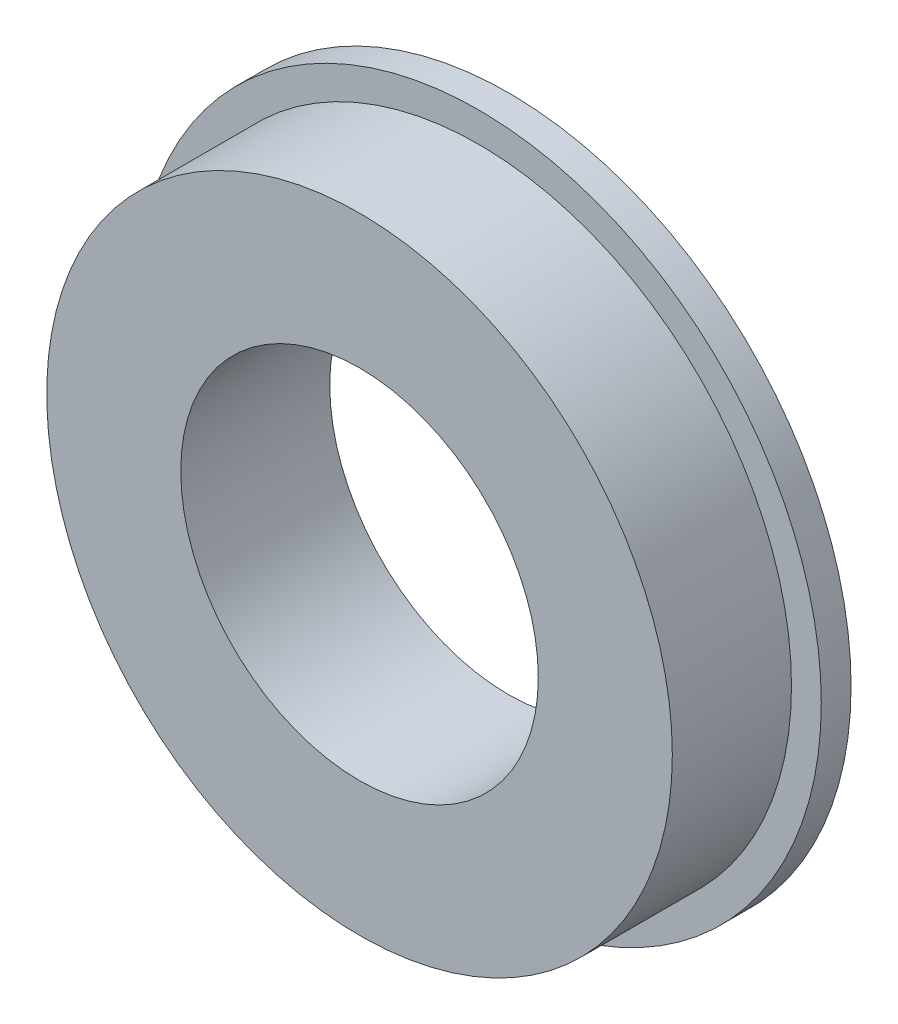
ISO-10303-21;
HEADER;
FILE_DESCRIPTION(('STEP AP214'),'2;1');
FILE_NAME('part.step','',(''),(''),'','','');
FILE_SCHEMA(('AUTOMOTIVE_DESIGN { 1 0 10303 214 1 1 1 1 }'));
ENDSEC;
DATA;
#1=APPLICATION_CONTEXT('core data for automotive mechanical design processes');
#2=APPLICATION_PROTOCOL_DEFINITION('international standard','automotive_design',2000,#1);
#3=PRODUCT_CONTEXT('',#1,'mechanical');
#4=PRODUCT('Part','Part','',(#3));
#5=PRODUCT_RELATED_PRODUCT_CATEGORY('part','',(#4));
#6=PRODUCT_DEFINITION_FORMATION('','',#4);
#7=PRODUCT_DEFINITION_CONTEXT('part definition',#1,'design');
#8=PRODUCT_DEFINITION('design','',#6,#7);
#9=PRODUCT_DEFINITION_SHAPE('','',#8);
#10=(LENGTH_UNIT() NAMED_UNIT(*) SI_UNIT(.MILLI.,.METRE.));
#11=(NAMED_UNIT(*) PLANE_ANGLE_UNIT() SI_UNIT($,.RADIAN.));
#12=(NAMED_UNIT(*) SI_UNIT($,.STERADIAN.) SOLID_ANGLE_UNIT());
#13=UNCERTAINTY_MEASURE_WITH_UNIT(LENGTH_MEASURE(1.E-05),#10,'distance_accuracy_value','');
#14=(GEOMETRIC_REPRESENTATION_CONTEXT(3) GLOBAL_UNCERTAINTY_ASSIGNED_CONTEXT((#13)) GLOBAL_UNIT_ASSIGNED_CONTEXT((#10,
#11,#12)) REPRESENTATION_CONTEXT('',''));
#15=CARTESIAN_POINT('',(0.,0.,0.));
#16=DIRECTION('',(0.,0.,1.));
#17=DIRECTION('',(1.,0.,0.));
#18=AXIS2_PLACEMENT_3D('',#15,#16,#17);
#19=CARTESIAN_POINT('',(0.,0.,1.));
#20=DIRECTION('',(0.,0.,-1.));
#21=DIRECTION('',(-1.,0.,0.));
#22=AXIS2_PLACEMENT_3D('',#19,#20,#21);
#23=CYLINDRICAL_SURFACE('',#22,11.5);
#24=CARTESIAN_POINT('',(0.,0.,1.));
#25=DIRECTION('',(0.,0.,1.));
#26=DIRECTION('',(1.,0.,0.));
#27=AXIS2_PLACEMENT_3D('',#24,#25,#26);
#28=CIRCLE('',#27,11.5);
#29=CARTESIAN_POINT('',(11.5,0.,1.));
#30=VERTEX_POINT('',#29);
#31=EDGE_CURVE('E10',#30,#30,#28,.T.);
#32=ORIENTED_EDGE('',*,*,#31,.F.);
#33=EDGE_LOOP('',(#32));
#34=FACE_BOUND('',#33,.T.);
#35=CARTESIAN_POINT('',(0.,0.,0.));
#36=DIRECTION('',(0.,0.,1.));
#37=DIRECTION('',(1.,0.,0.));
#38=AXIS2_PLACEMENT_3D('',#35,#36,#37);
#39=CIRCLE('',#38,11.5);
#40=CARTESIAN_POINT('',(11.5,0.,0.));
#41=VERTEX_POINT('',#40);
#42=EDGE_CURVE('E36',#41,#41,#39,.T.);
#43=ORIENTED_EDGE('',*,*,#42,.T.);
#44=EDGE_LOOP('',(#43));
#45=FACE_BOUND('',#44,.T.);
#46=ADVANCED_FACE('F33',(#34,#45),#23,.T.);
#47=CARTESIAN_POINT('',(0.,0.,1.));
#48=DIRECTION('',(0.,0.,1.));
#49=DIRECTION('',(1.,0.,0.));
#50=AXIS2_PLACEMENT_3D('',#47,#48,#49);
#51=PLANE('',#50);
#52=CARTESIAN_POINT('',(0.,0.,1.));
#53=DIRECTION('',(0.,0.,1.));
#54=DIRECTION('',(1.,0.,0.));
#55=AXIS2_PLACEMENT_3D('',#52,#53,#54);
#56=CIRCLE('',#55,10.5);
#57=CARTESIAN_POINT('',(10.5,0.,1.));
#58=VERTEX_POINT('',#57);
#59=EDGE_CURVE('E45',#58,#58,#56,.T.);
#60=ORIENTED_EDGE('',*,*,#59,.F.);
#61=EDGE_LOOP('',(#60));
#62=FACE_BOUND('',#61,.T.);
#63=ORIENTED_EDGE('',*,*,#31,.T.);
#64=EDGE_LOOP('',(#63));
#65=FACE_BOUND('',#64,.T.);
#66=ADVANCED_FACE('F78',(#62,#65),#51,.T.);
#67=CARTESIAN_POINT('',(0.,0.,0.));
#68=DIRECTION('',(0.,0.,1.));
#69=DIRECTION('',(1.,0.,0.));
#70=AXIS2_PLACEMENT_3D('',#67,#68,#69);
#71=PLANE('',#70);
#72=CARTESIAN_POINT('',(0.,0.,0.));
#73=DIRECTION('',(0.,0.,1.));
#74=DIRECTION('',(1.,0.,0.));
#75=AXIS2_PLACEMENT_3D('',#72,#73,#74);
#76=CIRCLE('',#75,6.);
#77=CARTESIAN_POINT('',(6.,0.,0.));
#78=VERTEX_POINT('',#77);
#79=EDGE_CURVE('E48',#78,#78,#76,.T.);
#80=ORIENTED_EDGE('',*,*,#79,.T.);
#81=EDGE_LOOP('',(#80));
#82=FACE_BOUND('',#81,.T.);
#83=ORIENTED_EDGE('',*,*,#42,.F.);
#84=EDGE_LOOP('',(#83));
#85=FACE_BOUND('',#84,.T.);
#86=ADVANCED_FACE('F57',(#82,#85),#71,.F.);
#87=CARTESIAN_POINT('',(0.,0.,5.));
#88=DIRECTION('',(0.,0.,-1.));
#89=DIRECTION('',(-1.,0.,0.));
#90=AXIS2_PLACEMENT_3D('',#87,#88,#89);
#91=CYLINDRICAL_SURFACE('',#90,10.5);
#92=CARTESIAN_POINT('',(0.,0.,5.));
#93=DIRECTION('',(0.,0.,1.));
#94=DIRECTION('',(1.,0.,0.));
#95=AXIS2_PLACEMENT_3D('',#92,#93,#94);
#96=CIRCLE('',#95,10.5);
#97=CARTESIAN_POINT('',(10.5,0.,5.));
#98=VERTEX_POINT('',#97);
#99=EDGE_CURVE('E43',#98,#98,#96,.T.);
#100=ORIENTED_EDGE('',*,*,#99,.F.);
#101=EDGE_LOOP('',(#100));
#102=FACE_BOUND('',#101,.T.);
#103=ORIENTED_EDGE('',*,*,#59,.T.);
#104=EDGE_LOOP('',(#103));
#105=FACE_BOUND('',#104,.T.);
#106=ADVANCED_FACE('F69',(#102,#105),#91,.T.);
#107=CARTESIAN_POINT('',(0.,0.,5.));
#108=DIRECTION('',(0.,0.,1.));
#109=DIRECTION('',(1.,0.,0.));
#110=AXIS2_PLACEMENT_3D('',#107,#108,#109);
#111=PLANE('',#110);
#112=CARTESIAN_POINT('',(0.,0.,5.));
#113=DIRECTION('',(0.,0.,1.));
#114=DIRECTION('',(1.,0.,0.));
#115=AXIS2_PLACEMENT_3D('',#112,#113,#114);
#116=CIRCLE('',#115,6.);
#117=CARTESIAN_POINT('',(6.,0.,5.));
#118=VERTEX_POINT('',#117);
#119=EDGE_CURVE('E51',#118,#118,#116,.T.);
#120=ORIENTED_EDGE('',*,*,#119,.F.);
#121=EDGE_LOOP('',(#120));
#122=FACE_BOUND('',#121,.T.);
#123=ORIENTED_EDGE('',*,*,#99,.T.);
#124=EDGE_LOOP('',(#123));
#125=FACE_BOUND('',#124,.T.);
#126=ADVANCED_FACE('F63',(#122,#125),#111,.T.);
#127=CARTESIAN_POINT('',(0.,0.,0.));
#128=DIRECTION('',(0.,0.,1.));
#129=DIRECTION('',(1.,0.,0.));
#130=AXIS2_PLACEMENT_3D('',#127,#128,#129);
#131=CYLINDRICAL_SURFACE('',#130,6.);
#132=ORIENTED_EDGE('',*,*,#79,.F.);
#133=EDGE_LOOP('',(#132));
#134=FACE_BOUND('',#133,.T.);
#135=ORIENTED_EDGE('',*,*,#119,.T.);
#136=EDGE_LOOP('',(#135));
#137=FACE_BOUND('',#136,.T.);
#138=ADVANCED_FACE('F60',(#134,#137),#131,.F.);
#139=CLOSED_SHELL('',(#46,#66,#86,#106,#126,#138));
#140=MANIFOLD_SOLID_BREP('B2',#139);
#141=ADVANCED_BREP_SHAPE_REPRESENTATION('',(#18,#140),#14);
#142=SHAPE_DEFINITION_REPRESENTATION(#9,#141);
ENDSEC;
END-ISO-10303-21;
